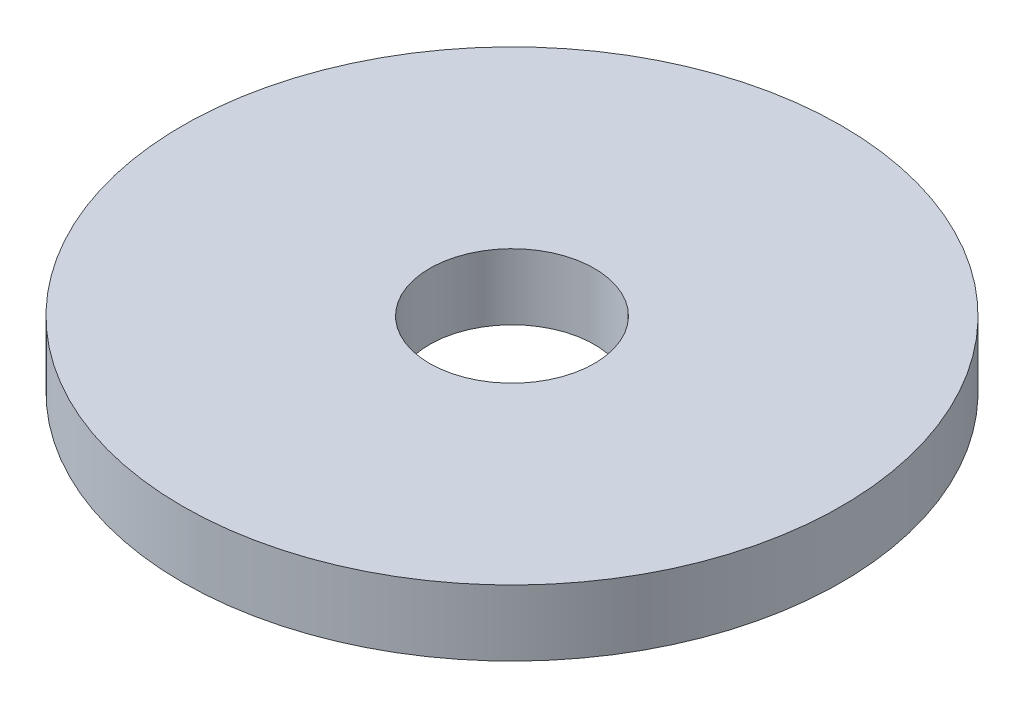
ISO-10303-21;
HEADER;
FILE_DESCRIPTION(('STEP AP214'),'2;1');
FILE_NAME('part.step','',(''),(''),'','','');
FILE_SCHEMA(('AUTOMOTIVE_DESIGN { 1 0 10303 214 1 1 1 1 }'));
ENDSEC;
DATA;
#1=APPLICATION_CONTEXT('core data for automotive mechanical design processes');
#2=APPLICATION_PROTOCOL_DEFINITION('international standard','automotive_design',2000,#1);
#3=PRODUCT_CONTEXT('',#1,'mechanical');
#4=PRODUCT('Part','Part','',(#3));
#5=PRODUCT_RELATED_PRODUCT_CATEGORY('part','',(#4));
#6=PRODUCT_DEFINITION_FORMATION('','',#4);
#7=PRODUCT_DEFINITION_CONTEXT('part definition',#1,'design');
#8=PRODUCT_DEFINITION('design','',#6,#7);
#9=PRODUCT_DEFINITION_SHAPE('','',#8);
#10=(LENGTH_UNIT() NAMED_UNIT(*) SI_UNIT(.MILLI.,.METRE.));
#11=(NAMED_UNIT(*) PLANE_ANGLE_UNIT() SI_UNIT($,.RADIAN.));
#12=(NAMED_UNIT(*) SI_UNIT($,.STERADIAN.) SOLID_ANGLE_UNIT());
#13=UNCERTAINTY_MEASURE_WITH_UNIT(LENGTH_MEASURE(1.E-05),#10,'distance_accuracy_value','');
#14=(GEOMETRIC_REPRESENTATION_CONTEXT(3) GLOBAL_UNCERTAINTY_ASSIGNED_CONTEXT((#13)) GLOBAL_UNIT_ASSIGNED_CONTEXT((#10,
#11,#12)) REPRESENTATION_CONTEXT('',''));
#15=CARTESIAN_POINT('',(0.,0.,0.));
#16=DIRECTION('',(0.,0.,1.));
#17=DIRECTION('',(1.,0.,0.));
#18=AXIS2_PLACEMENT_3D('',#15,#16,#17);
#19=CARTESIAN_POINT('',(0.,2.,0.));
#20=DIRECTION('',(0.,1.,0.));
#21=DIRECTION('',(0.,0.,1.));
#22=AXIS2_PLACEMENT_3D('',#19,#20,#21);
#23=PLANE('',#22);
#24=CARTESIAN_POINT('',(0.,2.,0.));
#25=DIRECTION('',(0.,1.,0.));
#26=DIRECTION('',(0.,0.,1.));
#27=AXIS2_PLACEMENT_3D('',#24,#25,#26);
#28=CIRCLE('',#27,2.5);
#29=CARTESIAN_POINT('',(0.,2.,2.5));
#30=VERTEX_POINT('',#29);
#31=EDGE_CURVE('E39',#30,#30,#28,.T.);
#32=ORIENTED_EDGE('',*,*,#31,.F.);
#33=EDGE_LOOP('',(#32));
#34=FACE_BOUND('',#33,.T.);
#35=CARTESIAN_POINT('',(0.,2.,0.));
#36=DIRECTION('',(0.,1.,0.));
#37=DIRECTION('',(0.,0.,1.));
#38=AXIS2_PLACEMENT_3D('',#35,#36,#37);
#39=CIRCLE('',#38,10.);
#40=CARTESIAN_POINT('',(0.,2.,10.));
#41=VERTEX_POINT('',#40);
#42=EDGE_CURVE('E45',#41,#41,#39,.T.);
#43=ORIENTED_EDGE('',*,*,#42,.T.);
#44=EDGE_LOOP('',(#43));
#45=FACE_BOUND('',#44,.T.);
#46=ADVANCED_FACE('F31',(#34,#45),#23,.T.);
#47=CARTESIAN_POINT('',(0.,0.,0.));
#48=DIRECTION('',(0.,1.,0.));
#49=DIRECTION('',(0.,0.,1.));
#50=AXIS2_PLACEMENT_3D('',#47,#48,#49);
#51=PLANE('',#50);
#52=CARTESIAN_POINT('',(0.,0.,0.));
#53=DIRECTION('',(0.,1.,0.));
#54=DIRECTION('',(0.,0.,1.));
#55=AXIS2_PLACEMENT_3D('',#52,#53,#54);
#56=CIRCLE('',#55,2.5);
#57=CARTESIAN_POINT('',(0.,0.,2.5));
#58=VERTEX_POINT('',#57);
#59=EDGE_CURVE('E10',#58,#58,#56,.T.);
#60=ORIENTED_EDGE('',*,*,#59,.T.);
#61=EDGE_LOOP('',(#60));
#62=FACE_BOUND('',#61,.T.);
#63=CARTESIAN_POINT('',(0.,0.,0.));
#64=DIRECTION('',(0.,1.,0.));
#65=DIRECTION('',(0.,0.,1.));
#66=AXIS2_PLACEMENT_3D('',#63,#64,#65);
#67=CIRCLE('',#66,10.);
#68=CARTESIAN_POINT('',(0.,0.,10.));
#69=VERTEX_POINT('',#68);
#70=EDGE_CURVE('E35',#69,#69,#67,.T.);
#71=ORIENTED_EDGE('',*,*,#70,.F.);
#72=EDGE_LOOP('',(#71));
#73=FACE_BOUND('',#72,.T.);
#74=ADVANCED_FACE('F33',(#62,#73),#51,.F.);
#75=CARTESIAN_POINT('',(0.,-8.,0.));
#76=DIRECTION('',(0.,1.,0.));
#77=DIRECTION('',(0.,0.,1.));
#78=AXIS2_PLACEMENT_3D('',#75,#76,#77);
#79=CYLINDRICAL_SURFACE('',#78,2.5);
#80=ORIENTED_EDGE('',*,*,#31,.T.);
#81=EDGE_LOOP('',(#80));
#82=FACE_BOUND('',#81,.T.);
#83=ORIENTED_EDGE('',*,*,#59,.F.);
#84=EDGE_LOOP('',(#83));
#85=FACE_BOUND('',#84,.T.);
#86=ADVANCED_FACE('F55',(#82,#85),#79,.F.);
#87=CARTESIAN_POINT('',(0.,-8.,0.));
#88=DIRECTION('',(0.,1.,0.));
#89=DIRECTION('',(0.,0.,1.));
#90=AXIS2_PLACEMENT_3D('',#87,#88,#89);
#91=CYLINDRICAL_SURFACE('',#90,10.);
#92=ORIENTED_EDGE('',*,*,#42,.F.);
#93=EDGE_LOOP('',(#92));
#94=FACE_BOUND('',#93,.T.);
#95=ORIENTED_EDGE('',*,*,#70,.T.);
#96=EDGE_LOOP('',(#95));
#97=FACE_BOUND('',#96,.T.);
#98=ADVANCED_FACE('F52',(#94,#97),#91,.T.);
#99=CLOSED_SHELL('',(#46,#74,#86,#98));
#100=MANIFOLD_SOLID_BREP('B2',#99);
#101=ADVANCED_BREP_SHAPE_REPRESENTATION('',(#18,#100),#14);
#102=SHAPE_DEFINITION_REPRESENTATION(#9,#101);
ENDSEC;
END-ISO-10303-21;
